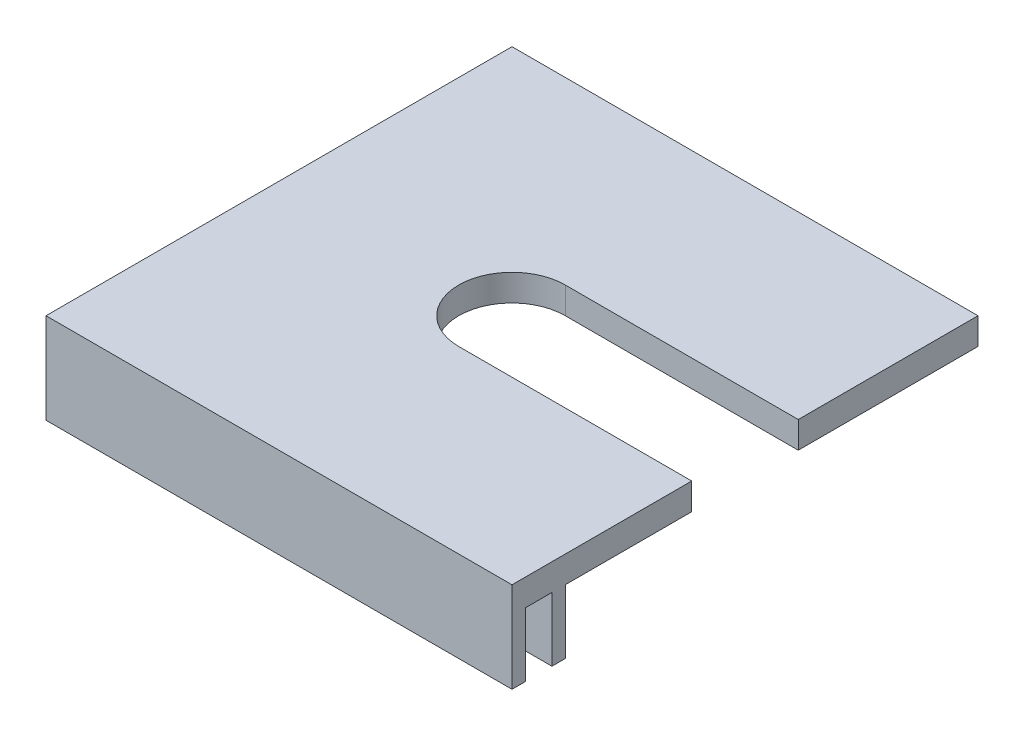
ISO-10303-21;
HEADER;
FILE_DESCRIPTION(('STEP AP214'),'2;1');
FILE_NAME('part.step','',(''),(''),'','','');
FILE_SCHEMA(('AUTOMOTIVE_DESIGN { 1 0 10303 214 1 1 1 1 }'));
ENDSEC;
DATA;
#1=APPLICATION_CONTEXT('core data for automotive mechanical design processes');
#2=APPLICATION_PROTOCOL_DEFINITION('international standard','automotive_design',2000,#1);
#3=PRODUCT_CONTEXT('',#1,'mechanical');
#4=PRODUCT('Part','Part','',(#3));
#5=PRODUCT_RELATED_PRODUCT_CATEGORY('part','',(#4));
#6=PRODUCT_DEFINITION_FORMATION('','',#4);
#7=PRODUCT_DEFINITION_CONTEXT('part definition',#1,'design');
#8=PRODUCT_DEFINITION('design','',#6,#7);
#9=PRODUCT_DEFINITION_SHAPE('','',#8);
#10=(LENGTH_UNIT() NAMED_UNIT(*) SI_UNIT(.MILLI.,.METRE.));
#11=(NAMED_UNIT(*) PLANE_ANGLE_UNIT() SI_UNIT($,.RADIAN.));
#12=(NAMED_UNIT(*) SI_UNIT($,.STERADIAN.) SOLID_ANGLE_UNIT());
#13=UNCERTAINTY_MEASURE_WITH_UNIT(LENGTH_MEASURE(1.E-05),#10,'distance_accuracy_value','');
#14=(GEOMETRIC_REPRESENTATION_CONTEXT(3) GLOBAL_UNCERTAINTY_ASSIGNED_CONTEXT((#13)) GLOBAL_UNIT_ASSIGNED_CONTEXT((#10,
#11,#12)) REPRESENTATION_CONTEXT('',''));
#15=CARTESIAN_POINT('',(0.,0.,0.));
#16=DIRECTION('',(0.,0.,1.));
#17=DIRECTION('',(1.,0.,0.));
#18=AXIS2_PLACEMENT_3D('',#15,#16,#17);
#19=CARTESIAN_POINT('',(0.,0.,0.));
#20=DIRECTION('',(0.,1.,0.));
#21=DIRECTION('',(0.,0.,1.));
#22=AXIS2_PLACEMENT_3D('',#19,#20,#21);
#23=PLANE('',#22);
#24=DIRECTION('',(1.,0.,0.));
#25=VECTOR('',#24,1.);
#26=CARTESIAN_POINT('',(0.,0.,-4.));
#27=LINE('',#26,#25);
#28=CARTESIAN_POINT('',(4.,0.,-4.));
#29=VERTEX_POINT('',#28);
#30=CARTESIAN_POINT('',(35.,0.,-4.));
#31=VERTEX_POINT('',#30);
#32=EDGE_CURVE('E271',#29,#31,#27,.T.);
#33=ORIENTED_EDGE('',*,*,#32,.F.);
#34=DIRECTION('',(0.,0.,1.));
#35=VECTOR('',#34,1.);
#36=CARTESIAN_POINT('',(4.,0.,0.));
#37=LINE('',#36,#35);
#38=CARTESIAN_POINT('',(4.,0.,-35.));
#39=VERTEX_POINT('',#38);
#40=EDGE_CURVE('E268',#39,#29,#37,.T.);
#41=ORIENTED_EDGE('',*,*,#40,.F.);
#42=DIRECTION('',(1.,0.,0.));
#43=VECTOR('',#42,1.);
#44=CARTESIAN_POINT('',(0.,0.,-35.));
#45=LINE('',#44,#43);
#46=CARTESIAN_POINT('',(35.,0.,-35.));
#47=VERTEX_POINT('',#46);
#48=EDGE_CURVE('E317',#39,#47,#45,.T.);
#49=ORIENTED_EDGE('',*,*,#48,.T.);
#50=DIRECTION('',(0.,0.,-1.));
#51=VECTOR('',#50,1.);
#52=CARTESIAN_POINT('',(35.,0.,0.));
#53=LINE('',#52,#51);
#54=CARTESIAN_POINT('',(35.,0.,-21.5));
#55=VERTEX_POINT('',#54);
#56=EDGE_CURVE('E314',#55,#47,#53,.T.);
#57=ORIENTED_EDGE('',*,*,#56,.F.);
#58=DIRECTION('',(-1.,0.,0.));
#59=VECTOR('',#58,1.);
#60=CARTESIAN_POINT('',(0.,0.,-21.5));
#61=LINE('',#60,#59);
#62=CARTESIAN_POINT('',(17.5,0.,-21.5));
#63=VERTEX_POINT('',#62);
#64=EDGE_CURVE('E311',#55,#63,#61,.T.);
#65=ORIENTED_EDGE('',*,*,#64,.T.);
#66=CARTESIAN_POINT('',(17.5,0.,-17.5));
#67=DIRECTION('',(0.,1.,0.));
#68=DIRECTION('',(0.,0.,1.));
#69=AXIS2_PLACEMENT_3D('',#66,#67,#68);
#70=CIRCLE('',#69,4.);
#71=CARTESIAN_POINT('',(17.5,0.,-13.5));
#72=VERTEX_POINT('',#71);
#73=EDGE_CURVE('E286',#63,#72,#70,.T.);
#74=ORIENTED_EDGE('',*,*,#73,.T.);
#75=DIRECTION('',(1.,0.,0.));
#76=VECTOR('',#75,1.);
#77=CARTESIAN_POINT('',(0.,0.,-13.5));
#78=LINE('',#77,#76);
#79=CARTESIAN_POINT('',(35.,0.,-13.5));
#80=VERTEX_POINT('',#79);
#81=EDGE_CURVE('E291',#72,#80,#78,.T.);
#82=ORIENTED_EDGE('',*,*,#81,.T.);
#83=EDGE_CURVE('E318',#31,#80,#53,.T.);
#84=ORIENTED_EDGE('',*,*,#83,.F.);
#85=EDGE_LOOP('',(#33,#41,#49,#57,#65,#74,#82,#84));
#86=FACE_BOUND('',#85,.T.);
#87=ADVANCED_FACE('F73',(#86),#23,.F.);
#88=DIRECTION('',(-1.,0.,0.));
#89=VECTOR('',#88,1.);
#90=CARTESIAN_POINT('',(0.,0.,-1.));
#91=LINE('',#90,#89);
#92=CARTESIAN_POINT('',(35.,0.,-0.999999999999998));
#93=VERTEX_POINT('',#92);
#94=CARTESIAN_POINT('',(0.999999999999998,0.,-1.));
#95=VERTEX_POINT('',#94);
#96=EDGE_CURVE('E236',#93,#95,#91,.T.);
#97=ORIENTED_EDGE('',*,*,#96,.T.);
#98=DIRECTION('',(0.,0.,-1.));
#99=VECTOR('',#98,1.);
#100=CARTESIAN_POINT('',(0.999999999999998,0.,0.));
#101=LINE('',#100,#99);
#102=CARTESIAN_POINT('',(1.,0.,-35.));
#103=VERTEX_POINT('',#102);
#104=EDGE_CURVE('E246',#95,#103,#101,.T.);
#105=ORIENTED_EDGE('',*,*,#104,.T.);
#106=CARTESIAN_POINT('',(3.,0.,-35.));
#107=VERTEX_POINT('',#106);
#108=EDGE_CURVE('E319',#103,#107,#45,.T.);
#109=ORIENTED_EDGE('',*,*,#108,.T.);
#110=DIRECTION('',(0.,0.,-1.));
#111=VECTOR('',#110,1.);
#112=CARTESIAN_POINT('',(3.,0.,0.));
#113=LINE('',#112,#111);
#114=CARTESIAN_POINT('',(3.,0.,-3.));
#115=VERTEX_POINT('',#114);
#116=EDGE_CURVE('E265',#115,#107,#113,.T.);
#117=ORIENTED_EDGE('',*,*,#116,.F.);
#118=DIRECTION('',(-1.,0.,0.));
#119=VECTOR('',#118,1.);
#120=CARTESIAN_POINT('',(0.,0.,-3.));
#121=LINE('',#120,#119);
#122=CARTESIAN_POINT('',(35.,0.,-3.));
#123=VERTEX_POINT('',#122);
#124=EDGE_CURVE('E242',#123,#115,#121,.T.);
#125=ORIENTED_EDGE('',*,*,#124,.F.);
#126=EDGE_CURVE('E258',#93,#123,#53,.T.);
#127=ORIENTED_EDGE('',*,*,#126,.F.);
#128=EDGE_LOOP('',(#97,#105,#109,#117,#125,#127));
#129=FACE_BOUND('',#128,.T.);
#130=ADVANCED_FACE('F255',(#129),#23,.F.);
#131=CARTESIAN_POINT('',(17.5,2.,-17.5));
#132=DIRECTION('',(0.,-1.,0.));
#133=DIRECTION('',(0.,0.,-1.));
#134=AXIS2_PLACEMENT_3D('',#131,#132,#133);
#135=CYLINDRICAL_SURFACE('',#134,4.);
#136=ORIENTED_EDGE('',*,*,#73,.F.);
#137=DIRECTION('',(0.,-1.,0.));
#138=VECTOR('',#137,1.);
#139=CARTESIAN_POINT('',(17.5,2.,-21.5));
#140=LINE('',#139,#138);
#141=CARTESIAN_POINT('',(17.5,2.,-21.5));
#142=VERTEX_POINT('',#141);
#143=EDGE_CURVE('E341',#142,#63,#140,.T.);
#144=ORIENTED_EDGE('',*,*,#143,.F.);
#145=CARTESIAN_POINT('',(17.5,2.,-17.5));
#146=DIRECTION('',(0.,1.,0.));
#147=DIRECTION('',(0.,0.,1.));
#148=AXIS2_PLACEMENT_3D('',#145,#146,#147);
#149=CIRCLE('',#148,4.);
#150=CARTESIAN_POINT('',(17.5,2.,-13.5));
#151=VERTEX_POINT('',#150);
#152=EDGE_CURVE('E287',#142,#151,#149,.T.);
#153=ORIENTED_EDGE('',*,*,#152,.T.);
#154=DIRECTION('',(0.,-1.,0.));
#155=VECTOR('',#154,1.);
#156=CARTESIAN_POINT('',(17.5,2.,-13.5));
#157=LINE('',#156,#155);
#158=EDGE_CURVE('E308',#151,#72,#157,.T.);
#159=ORIENTED_EDGE('',*,*,#158,.T.);
#160=EDGE_LOOP('',(#136,#144,#153,#159));
#161=FACE_BOUND('',#160,.T.);
#162=ADVANCED_FACE('F456',(#161),#135,.F.);
#163=CARTESIAN_POINT('',(0.,2.,-21.5));
#164=DIRECTION('',(0.,0.,1.));
#165=DIRECTION('',(1.,0.,0.));
#166=AXIS2_PLACEMENT_3D('',#163,#164,#165);
#167=PLANE('',#166);
#168=ORIENTED_EDGE('',*,*,#64,.F.);
#169=DIRECTION('',(0.,-1.,0.));
#170=VECTOR('',#169,1.);
#171=CARTESIAN_POINT('',(35.,2.,-21.5));
#172=LINE('',#171,#170);
#173=CARTESIAN_POINT('',(35.,2.,-21.5));
#174=VERTEX_POINT('',#173);
#175=EDGE_CURVE('E339',#174,#55,#172,.T.);
#176=ORIENTED_EDGE('',*,*,#175,.F.);
#177=DIRECTION('',(-1.,0.,0.));
#178=VECTOR('',#177,1.);
#179=CARTESIAN_POINT('',(0.,2.,-21.5));
#180=LINE('',#179,#178);
#181=EDGE_CURVE('E290',#174,#142,#180,.T.);
#182=ORIENTED_EDGE('',*,*,#181,.T.);
#183=ORIENTED_EDGE('',*,*,#143,.T.);
#184=EDGE_LOOP('',(#168,#176,#182,#183));
#185=FACE_BOUND('',#184,.T.);
#186=ADVANCED_FACE('F505',(#185),#167,.T.);
#187=CARTESIAN_POINT('',(35.,2.,0.));
#188=DIRECTION('',(-1.,0.,0.));
#189=DIRECTION('',(0.,0.,1.));
#190=AXIS2_PLACEMENT_3D('',#187,#188,#189);
#191=PLANE('',#190);
#192=ORIENTED_EDGE('',*,*,#56,.T.);
#193=DIRECTION('',(0.,-1.,0.));
#194=VECTOR('',#193,1.);
#195=CARTESIAN_POINT('',(35.,2.,-35.));
#196=LINE('',#195,#194);
#197=CARTESIAN_POINT('',(35.,2.,-35.));
#198=VERTEX_POINT('',#197);
#199=EDGE_CURVE('E336',#198,#47,#196,.T.);
#200=ORIENTED_EDGE('',*,*,#199,.F.);
#201=DIRECTION('',(0.,0.,-1.));
#202=VECTOR('',#201,1.);
#203=CARTESIAN_POINT('',(35.,2.,0.));
#204=LINE('',#203,#202);
#205=EDGE_CURVE('E294',#174,#198,#204,.T.);
#206=ORIENTED_EDGE('',*,*,#205,.F.);
#207=ORIENTED_EDGE('',*,*,#175,.T.);
#208=EDGE_LOOP('',(#192,#200,#206,#207));
#209=FACE_BOUND('',#208,.T.);
#210=ADVANCED_FACE('F502',(#209),#191,.F.);
#211=CARTESIAN_POINT('',(0.,2.,-35.));
#212=DIRECTION('',(0.,0.,-1.));
#213=DIRECTION('',(-1.,0.,0.));
#214=AXIS2_PLACEMENT_3D('',#211,#212,#213);
#215=PLANE('',#214);
#216=DIRECTION('',(0.,1.,0.));
#217=VECTOR('',#216,1.);
#218=CARTESIAN_POINT('',(1.,-5.,-35.));
#219=LINE('',#218,#217);
#220=CARTESIAN_POINT('',(1.,-4.80000000000001,-35.));
#221=VERTEX_POINT('',#220);
#222=EDGE_CURVE('E249',#221,#103,#219,.T.);
#223=ORIENTED_EDGE('',*,*,#222,.F.);
#224=DIRECTION('',(-1.,0.,0.));
#225=VECTOR('',#224,1.);
#226=CARTESIAN_POINT('',(0.,-4.80000000000001,-35.));
#227=LINE('',#226,#225);
#228=CARTESIAN_POINT('',(0.,-4.80000000000001,-35.));
#229=VERTEX_POINT('',#228);
#230=EDGE_CURVE('E358',#221,#229,#227,.T.);
#231=ORIENTED_EDGE('',*,*,#230,.T.);
#232=DIRECTION('',(0.,-1.,0.));
#233=VECTOR('',#232,1.);
#234=CARTESIAN_POINT('',(0.,2.,-35.));
#235=LINE('',#234,#233);
#236=CARTESIAN_POINT('',(0.,2.,-35.));
#237=VERTEX_POINT('',#236);
#238=EDGE_CURVE('E333',#237,#229,#235,.T.);
#239=ORIENTED_EDGE('',*,*,#238,.F.);
#240=DIRECTION('',(1.,0.,0.));
#241=VECTOR('',#240,1.);
#242=CARTESIAN_POINT('',(0.,2.,-35.));
#243=LINE('',#242,#241);
#244=EDGE_CURVE('E296',#237,#198,#243,.T.);
#245=ORIENTED_EDGE('',*,*,#244,.T.);
#246=ORIENTED_EDGE('',*,*,#199,.T.);
#247=ORIENTED_EDGE('',*,*,#48,.F.);
#248=DIRECTION('',(0.,1.,0.));
#249=VECTOR('',#248,1.);
#250=CARTESIAN_POINT('',(4.,-5.,-35.));
#251=LINE('',#250,#249);
#252=CARTESIAN_POINT('',(4.,-4.8,-35.));
#253=VERTEX_POINT('',#252);
#254=EDGE_CURVE('E280',#253,#39,#251,.T.);
#255=ORIENTED_EDGE('',*,*,#254,.F.);
#256=DIRECTION('',(-1.,0.,0.));
#257=VECTOR('',#256,1.);
#258=CARTESIAN_POINT('',(0.,-4.8,-35.));
#259=LINE('',#258,#257);
#260=CARTESIAN_POINT('',(3.,-4.8,-35.));
#261=VERTEX_POINT('',#260);
#262=EDGE_CURVE('E356',#253,#261,#259,.T.);
#263=ORIENTED_EDGE('',*,*,#262,.T.);
#264=DIRECTION('',(0.,1.,0.));
#265=VECTOR('',#264,1.);
#266=CARTESIAN_POINT('',(3.,-5.,-35.));
#267=LINE('',#266,#265);
#268=EDGE_CURVE('E282',#261,#107,#267,.T.);
#269=ORIENTED_EDGE('',*,*,#268,.T.);
#270=ORIENTED_EDGE('',*,*,#108,.F.);
#271=EDGE_LOOP('',(#223,#231,#239,#245,#246,#247,#255,#263,#269,#270));
#272=FACE_BOUND('',#271,.T.);
#273=ADVANCED_FACE('F431',(#272),#215,.T.);
#274=CARTESIAN_POINT('',(0.,2.,0.));
#275=DIRECTION('',(-1.,0.,0.));
#276=DIRECTION('',(0.,0.,1.));
#277=AXIS2_PLACEMENT_3D('',#274,#275,#276);
#278=PLANE('',#277);
#279=ORIENTED_EDGE('',*,*,#238,.T.);
#280=DIRECTION('',(0.,0.,1.));
#281=VECTOR('',#280,1.);
#282=CARTESIAN_POINT('',(0.,-4.80000000000001,0.));
#283=LINE('',#282,#281);
#284=CARTESIAN_POINT('',(0.,-4.80000000000001,0.));
#285=VERTEX_POINT('',#284);
#286=EDGE_CURVE('E361',#229,#285,#283,.T.);
#287=ORIENTED_EDGE('',*,*,#286,.T.);
#288=DIRECTION('',(0.,-1.,0.));
#289=VECTOR('',#288,1.);
#290=CARTESIAN_POINT('',(0.,2.,0.));
#291=LINE('',#290,#289);
#292=CARTESIAN_POINT('',(0.,2.,0.));
#293=VERTEX_POINT('',#292);
#294=EDGE_CURVE('E330',#293,#285,#291,.T.);
#295=ORIENTED_EDGE('',*,*,#294,.F.);
#296=DIRECTION('',(0.,0.,-1.));
#297=VECTOR('',#296,1.);
#298=CARTESIAN_POINT('',(0.,2.,0.));
#299=LINE('',#298,#297);
#300=EDGE_CURVE('E300',#293,#237,#299,.T.);
#301=ORIENTED_EDGE('',*,*,#300,.T.);
#302=EDGE_LOOP('',(#279,#287,#295,#301));
#303=FACE_BOUND('',#302,.T.);
#304=ADVANCED_FACE('F496',(#303),#278,.T.);
#305=CARTESIAN_POINT('',(0.,2.,0.));
#306=DIRECTION('',(0.,0.,-1.));
#307=DIRECTION('',(-1.,0.,0.));
#308=AXIS2_PLACEMENT_3D('',#305,#306,#307);
#309=PLANE('',#308);
#310=ORIENTED_EDGE('',*,*,#294,.T.);
#311=DIRECTION('',(1.,0.,0.));
#312=VECTOR('',#311,1.);
#313=CARTESIAN_POINT('',(35.,-4.80000000000001,0.));
#314=LINE('',#313,#312);
#315=CARTESIAN_POINT('',(35.,-4.80000000000001,0.));
#316=VERTEX_POINT('',#315);
#317=EDGE_CURVE('E363',#285,#316,#314,.T.);
#318=ORIENTED_EDGE('',*,*,#317,.T.);
#319=DIRECTION('',(0.,-1.,0.));
#320=VECTOR('',#319,1.);
#321=CARTESIAN_POINT('',(35.,2.,0.));
#322=LINE('',#321,#320);
#323=CARTESIAN_POINT('',(35.,2.,0.));
#324=VERTEX_POINT('',#323);
#325=EDGE_CURVE('E327',#324,#316,#322,.T.);
#326=ORIENTED_EDGE('',*,*,#325,.F.);
#327=DIRECTION('',(1.,0.,0.));
#328=VECTOR('',#327,1.);
#329=CARTESIAN_POINT('',(0.,2.,0.));
#330=LINE('',#329,#328);
#331=EDGE_CURVE('E303',#293,#324,#330,.T.);
#332=ORIENTED_EDGE('',*,*,#331,.F.);
#333=EDGE_LOOP('',(#310,#318,#326,#332));
#334=FACE_BOUND('',#333,.T.);
#335=ADVANCED_FACE('F497',(#334),#309,.F.);
#336=ORIENTED_EDGE('',*,*,#325,.T.);
#337=DIRECTION('',(0.,0.,-1.));
#338=VECTOR('',#337,1.);
#339=CARTESIAN_POINT('',(35.,-4.80000000000001,-0.999999999999998));
#340=LINE('',#339,#338);
#341=CARTESIAN_POINT('',(35.,-4.80000000000001,-0.999999999999998));
#342=VERTEX_POINT('',#341);
#343=EDGE_CURVE('E368',#316,#342,#340,.T.);
#344=ORIENTED_EDGE('',*,*,#343,.T.);
#345=DIRECTION('',(0.,1.,0.));
#346=VECTOR('',#345,1.);
#347=CARTESIAN_POINT('',(35.,-5.,-0.999999999999998));
#348=LINE('',#347,#346);
#349=EDGE_CURVE('E243',#342,#93,#348,.T.);
#350=ORIENTED_EDGE('',*,*,#349,.T.);
#351=ORIENTED_EDGE('',*,*,#126,.T.);
#352=DIRECTION('',(0.,1.,0.));
#353=VECTOR('',#352,1.);
#354=CARTESIAN_POINT('',(35.,-5.,-3.));
#355=LINE('',#354,#353);
#356=CARTESIAN_POINT('',(35.,-4.8,-3.));
#357=VERTEX_POINT('',#356);
#358=EDGE_CURVE('E274',#357,#123,#355,.T.);
#359=ORIENTED_EDGE('',*,*,#358,.F.);
#360=DIRECTION('',(0.,0.,-1.));
#361=VECTOR('',#360,1.);
#362=CARTESIAN_POINT('',(35.,-4.8,-4.));
#363=LINE('',#362,#361);
#364=CARTESIAN_POINT('',(35.,-4.8,-4.));
#365=VERTEX_POINT('',#364);
#366=EDGE_CURVE('E365',#357,#365,#363,.T.);
#367=ORIENTED_EDGE('',*,*,#366,.T.);
#368=DIRECTION('',(0.,1.,0.));
#369=VECTOR('',#368,1.);
#370=CARTESIAN_POINT('',(35.,-5.,-4.));
#371=LINE('',#370,#369);
#372=EDGE_CURVE('E276',#365,#31,#371,.T.);
#373=ORIENTED_EDGE('',*,*,#372,.T.);
#374=ORIENTED_EDGE('',*,*,#83,.T.);
#375=DIRECTION('',(0.,-1.,0.));
#376=VECTOR('',#375,1.);
#377=CARTESIAN_POINT('',(35.,2.,-13.5));
#378=LINE('',#377,#376);
#379=CARTESIAN_POINT('',(35.,2.,-13.5));
#380=VERTEX_POINT('',#379);
#381=EDGE_CURVE('E324',#380,#80,#378,.T.);
#382=ORIENTED_EDGE('',*,*,#381,.F.);
#383=EDGE_CURVE('E297',#324,#380,#204,.T.);
#384=ORIENTED_EDGE('',*,*,#383,.F.);
#385=EDGE_LOOP('',(#336,#344,#350,#351,#359,#367,#373,#374,#382,#384));
#386=FACE_BOUND('',#385,.T.);
#387=ADVANCED_FACE('F442',(#386),#191,.F.);
#388=CARTESIAN_POINT('',(0.,2.,-13.5));
#389=DIRECTION('',(0.,0.,-1.));
#390=DIRECTION('',(-1.,0.,0.));
#391=AXIS2_PLACEMENT_3D('',#388,#389,#390);
#392=PLANE('',#391);
#393=ORIENTED_EDGE('',*,*,#81,.F.);
#394=ORIENTED_EDGE('',*,*,#158,.F.);
#395=DIRECTION('',(1.,0.,0.));
#396=VECTOR('',#395,1.);
#397=CARTESIAN_POINT('',(0.,2.,-13.5));
#398=LINE('',#397,#396);
#399=EDGE_CURVE('E305',#151,#380,#398,.T.);
#400=ORIENTED_EDGE('',*,*,#399,.T.);
#401=ORIENTED_EDGE('',*,*,#381,.T.);
#402=EDGE_LOOP('',(#393,#394,#400,#401));
#403=FACE_BOUND('',#402,.T.);
#404=ADVANCED_FACE('F450',(#403),#392,.T.);
#405=CARTESIAN_POINT('',(0.,2.,0.));
#406=DIRECTION('',(0.,1.,0.));
#407=DIRECTION('',(0.,0.,1.));
#408=AXIS2_PLACEMENT_3D('',#405,#406,#407);
#409=PLANE('',#408);
#410=ORIENTED_EDGE('',*,*,#152,.F.);
#411=ORIENTED_EDGE('',*,*,#181,.F.);
#412=ORIENTED_EDGE('',*,*,#205,.T.);
#413=ORIENTED_EDGE('',*,*,#244,.F.);
#414=ORIENTED_EDGE('',*,*,#300,.F.);
#415=ORIENTED_EDGE('',*,*,#331,.T.);
#416=ORIENTED_EDGE('',*,*,#383,.T.);
#417=ORIENTED_EDGE('',*,*,#399,.F.);
#418=EDGE_LOOP('',(#410,#411,#412,#413,#414,#415,#416,#417));
#419=FACE_BOUND('',#418,.T.);
#420=ADVANCED_FACE('F460',(#419),#409,.T.);
#421=CARTESIAN_POINT('',(0.,-5.,-3.));
#422=DIRECTION('',(0.,0.,-1.));
#423=DIRECTION('',(-1.,0.,0.));
#424=AXIS2_PLACEMENT_3D('',#421,#422,#423);
#425=PLANE('',#424);
#426=DIRECTION('',(0.,1.,0.));
#427=VECTOR('',#426,1.);
#428=CARTESIAN_POINT('',(3.,-5.,-3.));
#429=LINE('',#428,#427);
#430=CARTESIAN_POINT('',(3.,-4.8,-3.));
#431=VERTEX_POINT('',#430);
#432=EDGE_CURVE('E284',#431,#115,#429,.T.);
#433=ORIENTED_EDGE('',*,*,#432,.F.);
#434=DIRECTION('',(1.,0.,0.));
#435=VECTOR('',#434,1.);
#436=CARTESIAN_POINT('',(35.,-4.8,-3.));
#437=LINE('',#436,#435);
#438=EDGE_CURVE('E12',#431,#357,#437,.T.);
#439=ORIENTED_EDGE('',*,*,#438,.T.);
#440=ORIENTED_EDGE('',*,*,#358,.T.);
#441=ORIENTED_EDGE('',*,*,#124,.T.);
#442=EDGE_LOOP('',(#433,#439,#440,#441));
#443=FACE_BOUND('',#442,.T.);
#444=ADVANCED_FACE('F436',(#443),#425,.F.);
#445=CARTESIAN_POINT('',(3.,-5.,0.));
#446=DIRECTION('',(1.,0.,0.));
#447=DIRECTION('',(0.,0.,-1.));
#448=AXIS2_PLACEMENT_3D('',#445,#446,#447);
#449=PLANE('',#448);
#450=ORIENTED_EDGE('',*,*,#268,.F.);
#451=DIRECTION('',(0.,0.,1.));
#452=VECTOR('',#451,1.);
#453=CARTESIAN_POINT('',(3.,-4.8,-3.));
#454=LINE('',#453,#452);
#455=EDGE_CURVE('E83',#261,#431,#454,.T.);
#456=ORIENTED_EDGE('',*,*,#455,.T.);
#457=ORIENTED_EDGE('',*,*,#432,.T.);
#458=ORIENTED_EDGE('',*,*,#116,.T.);
#459=EDGE_LOOP('',(#450,#456,#457,#458));
#460=FACE_BOUND('',#459,.T.);
#461=ADVANCED_FACE('F433',(#460),#449,.F.);
#462=CARTESIAN_POINT('',(4.,-5.,0.));
#463=DIRECTION('',(-1.,0.,0.));
#464=DIRECTION('',(0.,0.,1.));
#465=AXIS2_PLACEMENT_3D('',#462,#463,#464);
#466=PLANE('',#465);
#467=DIRECTION('',(0.,1.,0.));
#468=VECTOR('',#467,1.);
#469=CARTESIAN_POINT('',(4.,-5.,-4.));
#470=LINE('',#469,#468);
#471=CARTESIAN_POINT('',(4.,-4.8,-4.));
#472=VERTEX_POINT('',#471);
#473=EDGE_CURVE('E278',#472,#29,#470,.T.);
#474=ORIENTED_EDGE('',*,*,#473,.F.);
#475=DIRECTION('',(0.,0.,-1.));
#476=VECTOR('',#475,1.);
#477=CARTESIAN_POINT('',(4.,-4.8,-35.));
#478=LINE('',#477,#476);
#479=EDGE_CURVE('E387',#472,#253,#478,.T.);
#480=ORIENTED_EDGE('',*,*,#479,.T.);
#481=ORIENTED_EDGE('',*,*,#254,.T.);
#482=ORIENTED_EDGE('',*,*,#40,.T.);
#483=EDGE_LOOP('',(#474,#480,#481,#482));
#484=FACE_BOUND('',#483,.T.);
#485=ADVANCED_FACE('F567',(#484),#466,.F.);
#486=CARTESIAN_POINT('',(0.,-5.,-4.));
#487=DIRECTION('',(0.,0.,1.));
#488=DIRECTION('',(1.,0.,0.));
#489=AXIS2_PLACEMENT_3D('',#486,#487,#488);
#490=PLANE('',#489);
#491=ORIENTED_EDGE('',*,*,#372,.F.);
#492=DIRECTION('',(-1.,0.,0.));
#493=VECTOR('',#492,1.);
#494=CARTESIAN_POINT('',(4.,-4.8,-4.));
#495=LINE('',#494,#493);
#496=EDGE_CURVE('E98',#365,#472,#495,.T.);
#497=ORIENTED_EDGE('',*,*,#496,.T.);
#498=ORIENTED_EDGE('',*,*,#473,.T.);
#499=ORIENTED_EDGE('',*,*,#32,.T.);
#500=EDGE_LOOP('',(#491,#497,#498,#499));
#501=FACE_BOUND('',#500,.T.);
#502=ADVANCED_FACE('F574',(#501),#490,.F.);
#503=CARTESIAN_POINT('',(0.,-5.,0.));
#504=DIRECTION('',(0.,-1.,0.));
#505=DIRECTION('',(0.,0.,-1.));
#506=AXIS2_PLACEMENT_3D('',#503,#504,#505);
#507=PLANE('',#506);
#508=DIRECTION('',(1.,0.,0.));
#509=VECTOR('',#508,1.);
#510=CARTESIAN_POINT('',(35.,-5.,-3.80000000000001));
#511=LINE('',#510,#509);
#512=CARTESIAN_POINT('',(3.80000000000001,-5.,-3.80000000000001));
#513=VERTEX_POINT('',#512);
#514=CARTESIAN_POINT('',(34.8,-5.,-3.80000000000001));
#515=VERTEX_POINT('',#514);
#516=EDGE_CURVE('E381',#513,#515,#511,.T.);
#517=ORIENTED_EDGE('',*,*,#516,.T.);
#518=DIRECTION('',(0.,0.,1.));
#519=VECTOR('',#518,1.);
#520=CARTESIAN_POINT('',(34.8,-5.,-3.));
#521=LINE('',#520,#519);
#522=CARTESIAN_POINT('',(34.8,-5.,-3.19999999999999));
#523=VERTEX_POINT('',#522);
#524=EDGE_CURVE('E383',#515,#523,#521,.T.);
#525=ORIENTED_EDGE('',*,*,#524,.T.);
#526=DIRECTION('',(-1.,0.,0.));
#527=VECTOR('',#526,1.);
#528=CARTESIAN_POINT('',(3.,-5.,-3.19999999999999));
#529=LINE('',#528,#527);
#530=CARTESIAN_POINT('',(3.19999999999999,-5.,-3.19999999999999));
#531=VERTEX_POINT('',#530);
#532=EDGE_CURVE('E373',#523,#531,#529,.T.);
#533=ORIENTED_EDGE('',*,*,#532,.T.);
#534=DIRECTION('',(0.,0.,-1.));
#535=VECTOR('',#534,1.);
#536=CARTESIAN_POINT('',(3.19999999999999,-5.,-35.));
#537=LINE('',#536,#535);
#538=CARTESIAN_POINT('',(3.19999999999999,-5.,-34.8));
#539=VERTEX_POINT('',#538);
#540=EDGE_CURVE('E375',#531,#539,#537,.T.);
#541=ORIENTED_EDGE('',*,*,#540,.T.);
#542=DIRECTION('',(1.,0.,0.));
#543=VECTOR('',#542,1.);
#544=CARTESIAN_POINT('',(0.,-5.,-34.8));
#545=LINE('',#544,#543);
#546=CARTESIAN_POINT('',(3.80000000000001,-5.,-34.8));
#547=VERTEX_POINT('',#546);
#548=EDGE_CURVE('E377',#539,#547,#545,.T.);
#549=ORIENTED_EDGE('',*,*,#548,.T.);
#550=DIRECTION('',(0.,0.,1.));
#551=VECTOR('',#550,1.);
#552=CARTESIAN_POINT('',(3.80000000000001,-5.,-4.));
#553=LINE('',#552,#551);
#554=EDGE_CURVE('E379',#547,#513,#553,.T.);
#555=ORIENTED_EDGE('',*,*,#554,.T.);
#556=EDGE_LOOP('',(#517,#525,#533,#541,#549,#555));
#557=FACE_BOUND('',#556,.T.);
#558=ADVANCED_FACE('F582',(#557),#507,.T.);
#559=CARTESIAN_POINT('',(0.999999999999998,-5.,0.));
#560=DIRECTION('',(1.,0.,0.));
#561=DIRECTION('',(0.,0.,-1.));
#562=AXIS2_PLACEMENT_3D('',#559,#560,#561);
#563=PLANE('',#562);
#564=DIRECTION('',(0.,1.,0.));
#565=VECTOR('',#564,1.);
#566=CARTESIAN_POINT('',(0.999999999999998,-5.,-1.));
#567=LINE('',#566,#565);
#568=CARTESIAN_POINT('',(0.999999999999998,-4.80000000000001,-1.));
#569=VERTEX_POINT('',#568);
#570=EDGE_CURVE('E231',#569,#95,#567,.T.);
#571=ORIENTED_EDGE('',*,*,#570,.F.);
#572=DIRECTION('',(0.,0.,-1.));
#573=VECTOR('',#572,1.);
#574=CARTESIAN_POINT('',(0.999999999999998,-4.80000000000001,0.));
#575=LINE('',#574,#573);
#576=EDGE_CURVE('E371',#569,#221,#575,.T.);
#577=ORIENTED_EDGE('',*,*,#576,.T.);
#578=ORIENTED_EDGE('',*,*,#222,.T.);
#579=ORIENTED_EDGE('',*,*,#104,.F.);
#580=EDGE_LOOP('',(#571,#577,#578,#579));
#581=FACE_BOUND('',#580,.T.);
#582=ADVANCED_FACE('F247',(#581),#563,.T.);
#583=CARTESIAN_POINT('',(0.,-5.,-1.));
#584=DIRECTION('',(0.,0.,-1.));
#585=DIRECTION('',(-1.,0.,0.));
#586=AXIS2_PLACEMENT_3D('',#583,#584,#585);
#587=PLANE('',#586);
#588=ORIENTED_EDGE('',*,*,#349,.F.);
#589=DIRECTION('',(-1.,0.,0.));
#590=VECTOR('',#589,1.);
#591=CARTESIAN_POINT('',(0.,-4.80000000000001,-1.));
#592=LINE('',#591,#590);
#593=EDGE_CURVE('E239',#342,#569,#592,.T.);
#594=ORIENTED_EDGE('',*,*,#593,.T.);
#595=ORIENTED_EDGE('',*,*,#570,.T.);
#596=ORIENTED_EDGE('',*,*,#96,.F.);
#597=EDGE_LOOP('',(#588,#594,#595,#596));
#598=FACE_BOUND('',#597,.T.);
#599=ADVANCED_FACE('F234',(#598),#587,.T.);
#600=CARTESIAN_POINT('',(0.,-5.,0.));
#601=DIRECTION('',(0.,-1.,0.));
#602=DIRECTION('',(0.,0.,-1.));
#603=AXIS2_PLACEMENT_3D('',#600,#601,#602);
#604=PLANE('',#603);
#605=DIRECTION('',(0.,0.,-1.));
#606=VECTOR('',#605,1.);
#607=CARTESIAN_POINT('',(0.199999999999999,-5.,0.));
#608=LINE('',#607,#606);
#609=CARTESIAN_POINT('',(0.199999999999999,-5.,-0.199999999999999));
#610=VERTEX_POINT('',#609);
#611=CARTESIAN_POINT('',(0.199999999999999,-5.,-34.8));
#612=VERTEX_POINT('',#611);
#613=EDGE_CURVE('E351',#610,#612,#608,.T.);
#614=ORIENTED_EDGE('',*,*,#613,.T.);
#615=DIRECTION('',(1.,0.,0.));
#616=VECTOR('',#615,1.);
#617=CARTESIAN_POINT('',(0.,-5.,-34.8));
#618=LINE('',#617,#616);
#619=CARTESIAN_POINT('',(0.800000000000003,-5.,-34.8));
#620=VERTEX_POINT('',#619);
#621=EDGE_CURVE('E353',#612,#620,#618,.T.);
#622=ORIENTED_EDGE('',*,*,#621,.T.);
#623=DIRECTION('',(0.,0.,1.));
#624=VECTOR('',#623,1.);
#625=CARTESIAN_POINT('',(0.799999999999999,-5.,0.));
#626=LINE('',#625,#624);
#627=CARTESIAN_POINT('',(0.799999999999999,-5.,-0.800000000000003));
#628=VERTEX_POINT('',#627);
#629=EDGE_CURVE('E343',#620,#628,#626,.T.);
#630=ORIENTED_EDGE('',*,*,#629,.T.);
#631=DIRECTION('',(1.,0.,0.));
#632=VECTOR('',#631,1.);
#633=CARTESIAN_POINT('',(0.,-5.,-0.800000000000003));
#634=LINE('',#633,#632);
#635=CARTESIAN_POINT('',(34.8,-5.,-0.799999999999999));
#636=VERTEX_POINT('',#635);
#637=EDGE_CURVE('E345',#628,#636,#634,.T.);
#638=ORIENTED_EDGE('',*,*,#637,.T.);
#639=DIRECTION('',(0.,0.,1.));
#640=VECTOR('',#639,1.);
#641=CARTESIAN_POINT('',(34.8,-5.,0.));
#642=LINE('',#641,#640);
#643=CARTESIAN_POINT('',(34.8,-5.,-0.199999999999999));
#644=VERTEX_POINT('',#643);
#645=EDGE_CURVE('E347',#636,#644,#642,.T.);
#646=ORIENTED_EDGE('',*,*,#645,.T.);
#647=DIRECTION('',(-1.,0.,0.));
#648=VECTOR('',#647,1.);
#649=CARTESIAN_POINT('',(0.,-5.,-0.199999999999999));
#650=LINE('',#649,#648);
#651=EDGE_CURVE('E349',#644,#610,#650,.T.);
#652=ORIENTED_EDGE('',*,*,#651,.T.);
#653=EDGE_LOOP('',(#614,#622,#630,#638,#646,#652));
#654=FACE_BOUND('',#653,.T.);
#655=ADVANCED_FACE('F478',(#654),#604,.T.);
#656=CARTESIAN_POINT('',(34.8,-5.,0.));
#657=DIRECTION('',(0.707106781186535,-0.70710678118656,0.));
#658=DIRECTION('',(0.,0.,-1.));
#659=AXIS2_PLACEMENT_3D('',#656,#657,#658);
#660=PLANE('',#659);
#661=DIRECTION('',(0.577350269189633,0.577350269189612,-0.577350269189632));
#662=VECTOR('',#661,1.);
#663=CARTESIAN_POINT('',(23.3333333333331,-16.4666666666665,10.6666666666669));
#664=LINE('',#663,#662);
#665=EDGE_CURVE('E400',#342,#636,#664,.F.);
#666=ORIENTED_EDGE('',*,*,#665,.F.);
#667=ORIENTED_EDGE('',*,*,#343,.F.);
#668=DIRECTION('',(-0.577350269189633,-0.577350269189612,-0.577350269189633));
#669=VECTOR('',#668,1.);
#670=CARTESIAN_POINT('',(34.8666666666667,-4.93333333333333,-0.133333333333331));
#671=LINE('',#670,#669);
#672=EDGE_CURVE('E253',#644,#316,#671,.F.);
#673=ORIENTED_EDGE('',*,*,#672,.F.);
#674=ORIENTED_EDGE('',*,*,#645,.F.);
#675=EDGE_LOOP('',(#666,#667,#673,#674));
#676=FACE_BOUND('',#675,.T.);
#677=ADVANCED_FACE('F469',(#676),#660,.T.);
#678=CARTESIAN_POINT('',(0.,-5.,-0.199999999999999));
#679=DIRECTION('',(0.,-0.70710678118656,0.707106781186535));
#680=DIRECTION('',(1.,0.,0.));
#681=AXIS2_PLACEMENT_3D('',#678,#679,#680);
#682=PLANE('',#681);
#683=ORIENTED_EDGE('',*,*,#672,.T.);
#684=ORIENTED_EDGE('',*,*,#317,.F.);
#685=DIRECTION('',(-0.577350269189633,0.577350269189612,0.577350269189633));
#686=VECTOR('',#685,1.);
#687=CARTESIAN_POINT('',(0.133333333333331,-4.93333333333333,-0.133333333333331));
#688=LINE('',#687,#686);
#689=EDGE_CURVE('E397',#610,#285,#688,.T.);
#690=ORIENTED_EDGE('',*,*,#689,.F.);
#691=ORIENTED_EDGE('',*,*,#651,.F.);
#692=EDGE_LOOP('',(#683,#684,#690,#691));
#693=FACE_BOUND('',#692,.T.);
#694=ADVANCED_FACE('F474',(#693),#682,.T.);
#695=CARTESIAN_POINT('',(0.,-4.80000000000001,-1.));
#696=DIRECTION('',(0.,0.70710678118656,0.707106781186535));
#697=DIRECTION('',(-1.,0.,0.));
#698=AXIS2_PLACEMENT_3D('',#695,#696,#697);
#699=PLANE('',#698);
#700=ORIENTED_EDGE('',*,*,#665,.T.);
#701=ORIENTED_EDGE('',*,*,#637,.F.);
#702=DIRECTION('',(-0.577350269189633,-0.577350269189612,0.577350269189632));
#703=VECTOR('',#702,1.);
#704=CARTESIAN_POINT('',(0.666666666666657,-5.13333333333334,-0.666666666666662));
#705=LINE('',#704,#703);
#706=EDGE_CURVE('E394',#569,#628,#705,.T.);
#707=ORIENTED_EDGE('',*,*,#706,.F.);
#708=ORIENTED_EDGE('',*,*,#593,.F.);
#709=EDGE_LOOP('',(#700,#701,#707,#708));
#710=FACE_BOUND('',#709,.T.);
#711=ADVANCED_FACE('F482',(#710),#699,.F.);
#712=CARTESIAN_POINT('',(0.199999999999999,-5.,0.));
#713=DIRECTION('',(0.707106781186535,0.70710678118656,0.));
#714=DIRECTION('',(0.,0.,-1.));
#715=AXIS2_PLACEMENT_3D('',#712,#713,#714);
#716=PLANE('',#715);
#717=ORIENTED_EDGE('',*,*,#689,.T.);
#718=ORIENTED_EDGE('',*,*,#286,.F.);
#719=DIRECTION('',(0.577350269189633,-0.577350269189612,0.577350269189633));
#720=VECTOR('',#719,1.);
#721=CARTESIAN_POINT('',(11.8000000000003,-16.5999999999999,-23.1999999999997));
#722=LINE('',#721,#720);
#723=EDGE_CURVE('E392',#612,#229,#722,.F.);
#724=ORIENTED_EDGE('',*,*,#723,.F.);
#725=ORIENTED_EDGE('',*,*,#613,.F.);
#726=EDGE_LOOP('',(#717,#718,#724,#725));
#727=FACE_BOUND('',#726,.T.);
#728=ADVANCED_FACE('F494',(#727),#716,.F.);
#729=CARTESIAN_POINT('',(0.999999999999998,-4.80000000000001,0.));
#730=DIRECTION('',(-0.707106781186535,0.70710678118656,0.));
#731=DIRECTION('',(0.,0.,-1.));
#732=AXIS2_PLACEMENT_3D('',#729,#730,#731);
#733=PLANE('',#732);
#734=ORIENTED_EDGE('',*,*,#706,.T.);
#735=ORIENTED_EDGE('',*,*,#629,.F.);
#736=DIRECTION('',(0.577350269189633,0.577350269189612,-0.577350269189632));
#737=VECTOR('',#736,1.);
#738=CARTESIAN_POINT('',(-10.6666666666669,-16.4666666666665,-23.3333333333331));
#739=LINE('',#738,#737);
#740=EDGE_CURVE('E390',#221,#620,#739,.F.);
#741=ORIENTED_EDGE('',*,*,#740,.F.);
#742=ORIENTED_EDGE('',*,*,#576,.F.);
#743=EDGE_LOOP('',(#734,#735,#741,#742));
#744=FACE_BOUND('',#743,.T.);
#745=ADVANCED_FACE('F487',(#744),#733,.F.);
#746=CARTESIAN_POINT('',(0.,-5.,-34.8));
#747=DIRECTION('',(0.,0.70710678118656,0.707106781186535));
#748=DIRECTION('',(1.,0.,0.));
#749=AXIS2_PLACEMENT_3D('',#746,#747,#748);
#750=PLANE('',#749);
#751=ORIENTED_EDGE('',*,*,#723,.T.);
#752=ORIENTED_EDGE('',*,*,#230,.F.);
#753=ORIENTED_EDGE('',*,*,#740,.T.);
#754=ORIENTED_EDGE('',*,*,#621,.F.);
#755=EDGE_LOOP('',(#751,#752,#753,#754));
#756=FACE_BOUND('',#755,.T.);
#757=ADVANCED_FACE('F490',(#756),#750,.F.);
#758=CARTESIAN_POINT('',(0.,-5.,-34.8));
#759=DIRECTION('',(0.,0.707106781186535,0.70710678118656));
#760=DIRECTION('',(1.,0.,0.));
#761=AXIS2_PLACEMENT_3D('',#758,#759,#760);
#762=PLANE('',#761);
#763=DIRECTION('',(-0.577350269189619,0.577350269189639,-0.577350269189619));
#764=VECTOR('',#763,1.);
#765=CARTESIAN_POINT('',(14.7999999999997,-16.6000000000001,-23.2000000000003));
#766=LINE('',#765,#764);
#767=EDGE_CURVE('E414',#261,#539,#766,.F.);
#768=ORIENTED_EDGE('',*,*,#767,.F.);
#769=ORIENTED_EDGE('',*,*,#262,.F.);
#770=DIRECTION('',(0.577350269189619,0.577350269189639,-0.577350269189619));
#771=VECTOR('',#770,1.);
#772=CARTESIAN_POINT('',(2.53333333333337,-6.26666666666668,-33.5333333333334));
#773=LINE('',#772,#771);
#774=EDGE_CURVE('E78',#547,#253,#773,.T.);
#775=ORIENTED_EDGE('',*,*,#774,.F.);
#776=ORIENTED_EDGE('',*,*,#548,.F.);
#777=EDGE_LOOP('',(#768,#769,#775,#776));
#778=FACE_BOUND('',#777,.T.);
#779=ADVANCED_FACE('F76',(#778),#762,.F.);
#780=CARTESIAN_POINT('',(3.80000000000001,-5.,0.));
#781=DIRECTION('',(0.70710678118656,-0.707106781186535,0.));
#782=DIRECTION('',(0.,0.,-1.));
#783=AXIS2_PLACEMENT_3D('',#780,#781,#782);
#784=PLANE('',#783);
#785=ORIENTED_EDGE('',*,*,#774,.T.);
#786=ORIENTED_EDGE('',*,*,#479,.F.);
#787=DIRECTION('',(-0.577350269189619,-0.577350269189639,0.577350269189619));
#788=VECTOR('',#787,1.);
#789=CARTESIAN_POINT('',(2.53333333333337,-6.26666666666669,-2.53333333333337));
#790=LINE('',#789,#788);
#791=EDGE_CURVE('E412',#513,#472,#790,.F.);
#792=ORIENTED_EDGE('',*,*,#791,.F.);
#793=ORIENTED_EDGE('',*,*,#554,.F.);
#794=EDGE_LOOP('',(#785,#786,#792,#793));
#795=FACE_BOUND('',#794,.T.);
#796=ADVANCED_FACE('F424',(#795),#784,.T.);
#797=CARTESIAN_POINT('',(3.19999999999999,-5.,0.));
#798=DIRECTION('',(-0.70710678118656,-0.707106781186535,0.));
#799=DIRECTION('',(0.,0.,1.));
#800=AXIS2_PLACEMENT_3D('',#797,#798,#799);
#801=PLANE('',#800);
#802=ORIENTED_EDGE('',*,*,#767,.T.);
#803=ORIENTED_EDGE('',*,*,#540,.F.);
#804=DIRECTION('',(0.577350269189619,-0.577350269189639,-0.577350269189619));
#805=VECTOR('',#804,1.);
#806=CARTESIAN_POINT('',(2.13333333333335,-3.93333333333333,-2.13333333333336));
#807=LINE('',#806,#805);
#808=EDGE_CURVE('E409',#431,#531,#807,.T.);
#809=ORIENTED_EDGE('',*,*,#808,.F.);
#810=ORIENTED_EDGE('',*,*,#455,.F.);
#811=EDGE_LOOP('',(#802,#803,#809,#810));
#812=FACE_BOUND('',#811,.T.);
#813=ADVANCED_FACE('F655',(#812),#801,.T.);
#814=CARTESIAN_POINT('',(0.,-5.,-3.80000000000001));
#815=DIRECTION('',(0.,-0.707106781186535,-0.70710678118656));
#816=DIRECTION('',(-1.,0.,0.));
#817=AXIS2_PLACEMENT_3D('',#814,#815,#816);
#818=PLANE('',#817);
#819=ORIENTED_EDGE('',*,*,#791,.T.);
#820=ORIENTED_EDGE('',*,*,#496,.F.);
#821=DIRECTION('',(-0.577350269189619,-0.577350269189639,0.577350269189619));
#822=VECTOR('',#821,1.);
#823=CARTESIAN_POINT('',(23.2000000000003,-16.6000000000001,7.79999999999973));
#824=LINE('',#823,#822);
#825=EDGE_CURVE('E407',#515,#365,#824,.F.);
#826=ORIENTED_EDGE('',*,*,#825,.F.);
#827=ORIENTED_EDGE('',*,*,#516,.F.);
#828=EDGE_LOOP('',(#819,#820,#826,#827));
#829=FACE_BOUND('',#828,.T.);
#830=ADVANCED_FACE('F661',(#829),#818,.T.);
#831=CARTESIAN_POINT('',(0.,-5.,-3.19999999999999));
#832=DIRECTION('',(0.,-0.707106781186535,0.70710678118656));
#833=DIRECTION('',(1.,0.,0.));
#834=AXIS2_PLACEMENT_3D('',#831,#832,#833);
#835=PLANE('',#834);
#836=ORIENTED_EDGE('',*,*,#808,.T.);
#837=ORIENTED_EDGE('',*,*,#532,.F.);
#838=DIRECTION('',(0.577350269189619,0.577350269189639,0.577350269189619));
#839=VECTOR('',#838,1.);
#840=CARTESIAN_POINT('',(23.2000000000003,-16.6000000000001,-14.7999999999997));
#841=LINE('',#840,#839);
#842=EDGE_CURVE('E405',#357,#523,#841,.F.);
#843=ORIENTED_EDGE('',*,*,#842,.F.);
#844=ORIENTED_EDGE('',*,*,#438,.F.);
#845=EDGE_LOOP('',(#836,#837,#843,#844));
#846=FACE_BOUND('',#845,.T.);
#847=ADVANCED_FACE('F668',(#846),#835,.T.);
#848=CARTESIAN_POINT('',(34.8,-5.,0.));
#849=DIRECTION('',(0.70710678118656,-0.707106781186535,0.));
#850=DIRECTION('',(0.,0.,-1.));
#851=AXIS2_PLACEMENT_3D('',#848,#849,#850);
#852=PLANE('',#851);
#853=ORIENTED_EDGE('',*,*,#825,.T.);
#854=ORIENTED_EDGE('',*,*,#366,.F.);
#855=ORIENTED_EDGE('',*,*,#842,.T.);
#856=ORIENTED_EDGE('',*,*,#524,.F.);
#857=EDGE_LOOP('',(#853,#854,#855,#856));
#858=FACE_BOUND('',#857,.T.);
#859=ADVANCED_FACE('F676',(#858),#852,.T.);
#860=CLOSED_SHELL('',(#87,#130,#162,#186,#210,#273,#304,#335,#387,#404,#420,#444,#461,#485,#502,
#558,#582,#599,#655,#677,#694,#711,#728,#745,#757,#779,#796,#813,#830,#847,#859));
#861=MANIFOLD_SOLID_BREP('B2',#860);
#862=ADVANCED_BREP_SHAPE_REPRESENTATION('',(#18,#861),#14);
#863=SHAPE_DEFINITION_REPRESENTATION(#9,#862);
ENDSEC;
END-ISO-10303-21;
